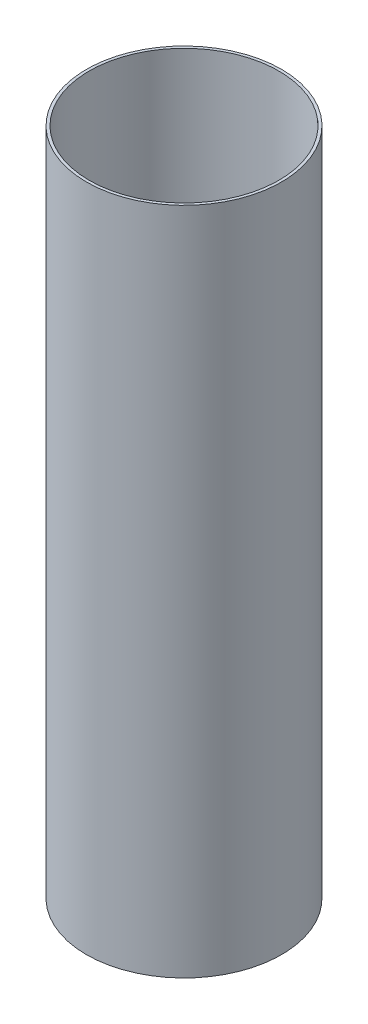
ISO-10303-21;
HEADER;
FILE_DESCRIPTION(('STEP AP214'),'2;1');
FILE_NAME('part.step','',(''),(''),'','','');
FILE_SCHEMA(('AUTOMOTIVE_DESIGN { 1 0 10303 214 1 1 1 1 }'));
ENDSEC;
DATA;
#1=APPLICATION_CONTEXT('core data for automotive mechanical design processes');
#2=APPLICATION_PROTOCOL_DEFINITION('international standard','automotive_design',2000,#1);
#3=PRODUCT_CONTEXT('',#1,'mechanical');
#4=PRODUCT('Part','Part','',(#3));
#5=PRODUCT_RELATED_PRODUCT_CATEGORY('part','',(#4));
#6=PRODUCT_DEFINITION_FORMATION('','',#4);
#7=PRODUCT_DEFINITION_CONTEXT('part definition',#1,'design');
#8=PRODUCT_DEFINITION('design','',#6,#7);
#9=PRODUCT_DEFINITION_SHAPE('','',#8);
#10=(LENGTH_UNIT() NAMED_UNIT(*) SI_UNIT(.MILLI.,.METRE.));
#11=(NAMED_UNIT(*) PLANE_ANGLE_UNIT() SI_UNIT($,.RADIAN.));
#12=(NAMED_UNIT(*) SI_UNIT($,.STERADIAN.) SOLID_ANGLE_UNIT());
#13=UNCERTAINTY_MEASURE_WITH_UNIT(LENGTH_MEASURE(1.E-05),#10,'distance_accuracy_value','');
#14=(GEOMETRIC_REPRESENTATION_CONTEXT(3) GLOBAL_UNCERTAINTY_ASSIGNED_CONTEXT((#13)) GLOBAL_UNIT_ASSIGNED_CONTEXT((#10,
#11,#12)) REPRESENTATION_CONTEXT('',''));
#15=CARTESIAN_POINT('',(0.,0.,0.));
#16=DIRECTION('',(0.,0.,1.));
#17=DIRECTION('',(1.,0.,0.));
#18=AXIS2_PLACEMENT_3D('',#15,#16,#17);
#19=CARTESIAN_POINT('',(0.,60.,0.));
#20=DIRECTION('',(0.,1.,0.));
#21=DIRECTION('',(0.,0.,1.));
#22=AXIS2_PLACEMENT_3D('',#19,#20,#21);
#23=PLANE('',#22);
#24=CARTESIAN_POINT('',(0.,60.,0.));
#25=DIRECTION('',(0.,1.,0.));
#26=DIRECTION('',(0.,0.,1.));
#27=AXIS2_PLACEMENT_3D('',#24,#25,#26);
#28=CIRCLE('',#27,17.5);
#29=CARTESIAN_POINT('',(0.,60.,17.5));
#30=VERTEX_POINT('',#29);
#31=EDGE_CURVE('E10',#30,#30,#28,.T.);
#32=ORIENTED_EDGE('',*,*,#31,.T.);
#33=EDGE_LOOP('',(#32));
#34=FACE_BOUND('',#33,.T.);
#35=CARTESIAN_POINT('',(0.,60.,0.));
#36=DIRECTION('',(0.,1.,0.));
#37=DIRECTION('',(0.,0.,1.));
#38=AXIS2_PLACEMENT_3D('',#35,#36,#37);
#39=CIRCLE('',#38,17.);
#40=CARTESIAN_POINT('',(0.,60.,17.));
#41=VERTEX_POINT('',#40);
#42=EDGE_CURVE('E46',#41,#41,#39,.T.);
#43=ORIENTED_EDGE('',*,*,#42,.F.);
#44=EDGE_LOOP('',(#43));
#45=FACE_BOUND('',#44,.T.);
#46=ADVANCED_FACE('F35',(#34,#45),#23,.T.);
#47=CARTESIAN_POINT('',(0.,-60.,0.));
#48=DIRECTION('',(0.,1.,0.));
#49=DIRECTION('',(0.,0.,1.));
#50=AXIS2_PLACEMENT_3D('',#47,#48,#49);
#51=PLANE('',#50);
#52=CARTESIAN_POINT('',(0.,-60.,0.));
#53=DIRECTION('',(0.,1.,0.));
#54=DIRECTION('',(0.,0.,1.));
#55=AXIS2_PLACEMENT_3D('',#52,#53,#54);
#56=CIRCLE('',#55,17.5);
#57=CARTESIAN_POINT('',(0.,-60.,17.5));
#58=VERTEX_POINT('',#57);
#59=EDGE_CURVE('E39',#58,#58,#56,.T.);
#60=ORIENTED_EDGE('',*,*,#59,.F.);
#61=EDGE_LOOP('',(#60));
#62=FACE_BOUND('',#61,.T.);
#63=CARTESIAN_POINT('',(0.,-60.,0.));
#64=DIRECTION('',(0.,1.,0.));
#65=DIRECTION('',(0.,0.,1.));
#66=AXIS2_PLACEMENT_3D('',#63,#64,#65);
#67=CIRCLE('',#66,17.);
#68=CARTESIAN_POINT('',(0.,-60.,17.));
#69=VERTEX_POINT('',#68);
#70=EDGE_CURVE('E48',#69,#69,#67,.T.);
#71=ORIENTED_EDGE('',*,*,#70,.T.);
#72=EDGE_LOOP('',(#71));
#73=FACE_BOUND('',#72,.T.);
#74=ADVANCED_FACE('F58',(#62,#73),#51,.F.);
#75=CARTESIAN_POINT('',(0.,60.,0.));
#76=DIRECTION('',(0.,-1.,0.));
#77=DIRECTION('',(0.,0.,-1.));
#78=AXIS2_PLACEMENT_3D('',#75,#76,#77);
#79=CYLINDRICAL_SURFACE('',#78,17.5);
#80=ORIENTED_EDGE('',*,*,#31,.F.);
#81=EDGE_LOOP('',(#80));
#82=FACE_BOUND('',#81,.T.);
#83=ORIENTED_EDGE('',*,*,#59,.T.);
#84=EDGE_LOOP('',(#83));
#85=FACE_BOUND('',#84,.T.);
#86=ADVANCED_FACE('F37',(#82,#85),#79,.T.);
#87=CARTESIAN_POINT('',(0.,60.,0.));
#88=DIRECTION('',(0.,-1.,0.));
#89=DIRECTION('',(0.,0.,-1.));
#90=AXIS2_PLACEMENT_3D('',#87,#88,#89);
#91=CYLINDRICAL_SURFACE('',#90,17.);
#92=ORIENTED_EDGE('',*,*,#42,.T.);
#93=EDGE_LOOP('',(#92));
#94=FACE_BOUND('',#93,.T.);
#95=ORIENTED_EDGE('',*,*,#70,.F.);
#96=EDGE_LOOP('',(#95));
#97=FACE_BOUND('',#96,.T.);
#98=ADVANCED_FACE('F54',(#94,#97),#91,.F.);
#99=CLOSED_SHELL('',(#46,#74,#86,#98));
#100=MANIFOLD_SOLID_BREP('B2',#99);
#101=ADVANCED_BREP_SHAPE_REPRESENTATION('',(#18,#100),#14);
#102=SHAPE_DEFINITION_REPRESENTATION(#9,#101);
ENDSEC;
END-ISO-10303-21;
